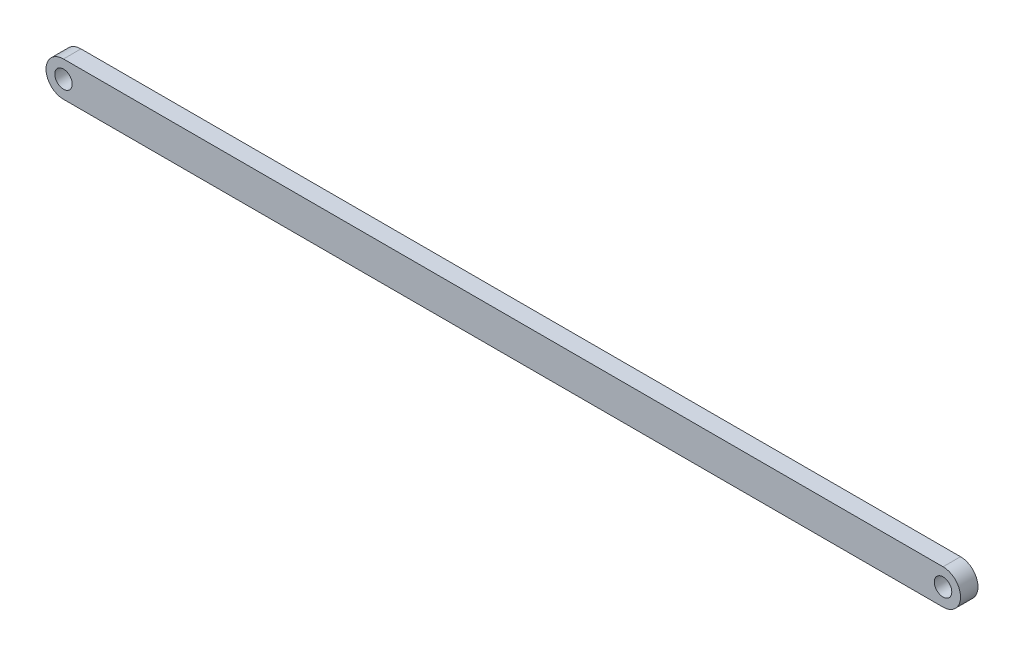
ISO-10303-21;
HEADER;
FILE_DESCRIPTION(('STEP AP214'),'2;1');
FILE_NAME('part.step','',(''),(''),'','','');
FILE_SCHEMA(('AUTOMOTIVE_DESIGN { 1 0 10303 214 1 1 1 1 }'));
ENDSEC;
DATA;
#1=APPLICATION_CONTEXT('core data for automotive mechanical design processes');
#2=APPLICATION_PROTOCOL_DEFINITION('international standard','automotive_design',2000,#1);
#3=PRODUCT_CONTEXT('',#1,'mechanical');
#4=PRODUCT('Part','Part','',(#3));
#5=PRODUCT_RELATED_PRODUCT_CATEGORY('part','',(#4));
#6=PRODUCT_DEFINITION_FORMATION('','',#4);
#7=PRODUCT_DEFINITION_CONTEXT('part definition',#1,'design');
#8=PRODUCT_DEFINITION('design','',#6,#7);
#9=PRODUCT_DEFINITION_SHAPE('','',#8);
#10=(LENGTH_UNIT() NAMED_UNIT(*) SI_UNIT(.MILLI.,.METRE.));
#11=(NAMED_UNIT(*) PLANE_ANGLE_UNIT() SI_UNIT($,.RADIAN.));
#12=(NAMED_UNIT(*) SI_UNIT($,.STERADIAN.) SOLID_ANGLE_UNIT());
#13=UNCERTAINTY_MEASURE_WITH_UNIT(LENGTH_MEASURE(1.E-05),#10,'distance_accuracy_value','');
#14=(GEOMETRIC_REPRESENTATION_CONTEXT(3) GLOBAL_UNCERTAINTY_ASSIGNED_CONTEXT((#13)) GLOBAL_UNIT_ASSIGNED_CONTEXT((#10,
#11,#12)) REPRESENTATION_CONTEXT('',''));
#15=CARTESIAN_POINT('',(0.,0.,0.));
#16=DIRECTION('',(0.,0.,1.));
#17=DIRECTION('',(1.,0.,0.));
#18=AXIS2_PLACEMENT_3D('',#15,#16,#17);
#19=CARTESIAN_POINT('',(125.84,0.,5.));
#20=DIRECTION('',(0.,0.,-1.));
#21=DIRECTION('',(-1.,0.,0.));
#22=AXIS2_PLACEMENT_3D('',#19,#20,#21);
#23=PLANE('',#22);
#24=CARTESIAN_POINT('',(125.84,0.,5.));
#25=DIRECTION('',(0.,0.,1.));
#26=DIRECTION('',(-1.,0.,0.));
#27=AXIS2_PLACEMENT_3D('',#24,#25,#26);
#28=CIRCLE('',#27,5.);
#29=CARTESIAN_POINT('',(125.84,-5.,5.));
#30=VERTEX_POINT('',#29);
#31=CARTESIAN_POINT('',(125.84,5.,5.));
#32=VERTEX_POINT('',#31);
#33=EDGE_CURVE('E96',#30,#32,#28,.T.);
#34=ORIENTED_EDGE('',*,*,#33,.T.);
#35=DIRECTION('',(-1.,0.,0.));
#36=VECTOR('',#35,1.);
#37=CARTESIAN_POINT('',(-125.84,5.,5.));
#38=LINE('',#37,#36);
#39=CARTESIAN_POINT('',(-125.84,5.,5.));
#40=VERTEX_POINT('',#39);
#41=EDGE_CURVE('E91',#32,#40,#38,.T.);
#42=ORIENTED_EDGE('',*,*,#41,.T.);
#43=CARTESIAN_POINT('',(-125.84,0.,5.));
#44=DIRECTION('',(0.,0.,1.));
#45=DIRECTION('',(1.,0.,0.));
#46=AXIS2_PLACEMENT_3D('',#43,#44,#45);
#47=CIRCLE('',#46,5.);
#48=CARTESIAN_POINT('',(-125.84,-5.,5.));
#49=VERTEX_POINT('',#48);
#50=EDGE_CURVE('E94',#40,#49,#47,.T.);
#51=ORIENTED_EDGE('',*,*,#50,.T.);
#52=DIRECTION('',(1.,0.,0.));
#53=VECTOR('',#52,1.);
#54=CARTESIAN_POINT('',(-125.84,-5.,5.));
#55=LINE('',#54,#53);
#56=EDGE_CURVE('E61',#49,#30,#55,.T.);
#57=ORIENTED_EDGE('',*,*,#56,.T.);
#58=EDGE_LOOP('',(#34,#42,#51,#57));
#59=FACE_BOUND('',#58,.T.);
#60=CARTESIAN_POINT('',(-125.84,0.,5.));
#61=DIRECTION('',(0.,0.,1.));
#62=DIRECTION('',(1.,0.,0.));
#63=AXIS2_PLACEMENT_3D('',#60,#61,#62);
#64=CIRCLE('',#63,2.5);
#65=CARTESIAN_POINT('',(-123.34,0.,5.));
#66=VERTEX_POINT('',#65);
#67=EDGE_CURVE('E116',#66,#66,#64,.T.);
#68=ORIENTED_EDGE('',*,*,#67,.F.);
#69=EDGE_LOOP('',(#68));
#70=FACE_BOUND('',#69,.T.);
#71=CARTESIAN_POINT('',(125.84,0.,5.));
#72=DIRECTION('',(0.,0.,1.));
#73=DIRECTION('',(1.,0.,0.));
#74=AXIS2_PLACEMENT_3D('',#71,#72,#73);
#75=CIRCLE('',#74,2.5);
#76=CARTESIAN_POINT('',(128.34,0.,5.));
#77=VERTEX_POINT('',#76);
#78=EDGE_CURVE('E138',#77,#77,#75,.T.);
#79=ORIENTED_EDGE('',*,*,#78,.F.);
#80=EDGE_LOOP('',(#79));
#81=FACE_BOUND('',#80,.T.);
#82=ADVANCED_FACE('F43',(#59,#70,#81),#23,.F.);
#83=CARTESIAN_POINT('',(125.84,0.,0.));
#84=DIRECTION('',(0.,0.,-1.));
#85=DIRECTION('',(-1.,0.,0.));
#86=AXIS2_PLACEMENT_3D('',#83,#84,#85);
#87=PLANE('',#86);
#88=CARTESIAN_POINT('',(-125.84,0.,0.));
#89=DIRECTION('',(0.,0.,1.));
#90=DIRECTION('',(1.,0.,0.));
#91=AXIS2_PLACEMENT_3D('',#88,#89,#90);
#92=CIRCLE('',#91,2.5);
#93=CARTESIAN_POINT('',(-123.34,0.,0.));
#94=VERTEX_POINT('',#93);
#95=EDGE_CURVE('E134',#94,#94,#92,.T.);
#96=ORIENTED_EDGE('',*,*,#95,.T.);
#97=EDGE_LOOP('',(#96));
#98=FACE_BOUND('',#97,.T.);
#99=CARTESIAN_POINT('',(125.84,0.,0.));
#100=DIRECTION('',(0.,0.,1.));
#101=DIRECTION('',(-1.,0.,0.));
#102=AXIS2_PLACEMENT_3D('',#99,#100,#101);
#103=CIRCLE('',#102,5.);
#104=CARTESIAN_POINT('',(125.84,-5.,0.));
#105=VERTEX_POINT('',#104);
#106=CARTESIAN_POINT('',(125.84,5.,0.));
#107=VERTEX_POINT('',#106);
#108=EDGE_CURVE('E112',#105,#107,#103,.T.);
#109=ORIENTED_EDGE('',*,*,#108,.F.);
#110=DIRECTION('',(1.,0.,0.));
#111=VECTOR('',#110,1.);
#112=CARTESIAN_POINT('',(-125.84,-5.,0.));
#113=LINE('',#112,#111);
#114=CARTESIAN_POINT('',(-125.84,-5.,0.));
#115=VERTEX_POINT('',#114);
#116=EDGE_CURVE('E84',#115,#105,#113,.T.);
#117=ORIENTED_EDGE('',*,*,#116,.F.);
#118=CARTESIAN_POINT('',(-125.84,0.,0.));
#119=DIRECTION('',(0.,0.,1.));
#120=DIRECTION('',(1.,0.,0.));
#121=AXIS2_PLACEMENT_3D('',#118,#119,#120);
#122=CIRCLE('',#121,5.);
#123=CARTESIAN_POINT('',(-125.84,5.,0.));
#124=VERTEX_POINT('',#123);
#125=EDGE_CURVE('E78',#124,#115,#122,.T.);
#126=ORIENTED_EDGE('',*,*,#125,.F.);
#127=DIRECTION('',(-1.,0.,0.));
#128=VECTOR('',#127,1.);
#129=CARTESIAN_POINT('',(-125.84,5.,0.));
#130=LINE('',#129,#128);
#131=EDGE_CURVE('E101',#107,#124,#130,.T.);
#132=ORIENTED_EDGE('',*,*,#131,.F.);
#133=EDGE_LOOP('',(#109,#117,#126,#132));
#134=FACE_BOUND('',#133,.T.);
#135=CARTESIAN_POINT('',(125.84,0.,0.));
#136=DIRECTION('',(0.,0.,1.));
#137=DIRECTION('',(1.,0.,0.));
#138=AXIS2_PLACEMENT_3D('',#135,#136,#137);
#139=CIRCLE('',#138,2.5);
#140=CARTESIAN_POINT('',(128.34,0.,0.));
#141=VERTEX_POINT('',#140);
#142=EDGE_CURVE('E142',#141,#141,#139,.T.);
#143=ORIENTED_EDGE('',*,*,#142,.T.);
#144=EDGE_LOOP('',(#143));
#145=FACE_BOUND('',#144,.T.);
#146=ADVANCED_FACE('F129',(#98,#134,#145),#87,.T.);
#147=CARTESIAN_POINT('',(125.84,0.,5.));
#148=DIRECTION('',(0.,0.,-1.));
#149=DIRECTION('',(-1.,0.,0.));
#150=AXIS2_PLACEMENT_3D('',#147,#148,#149);
#151=CYLINDRICAL_SURFACE('',#150,5.);
#152=ORIENTED_EDGE('',*,*,#108,.T.);
#153=DIRECTION('',(0.,0.,-1.));
#154=VECTOR('',#153,1.);
#155=CARTESIAN_POINT('',(125.84,5.,5.));
#156=LINE('',#155,#154);
#157=EDGE_CURVE('E11',#32,#107,#156,.T.);
#158=ORIENTED_EDGE('',*,*,#157,.F.);
#159=ORIENTED_EDGE('',*,*,#33,.F.);
#160=DIRECTION('',(0.,0.,-1.));
#161=VECTOR('',#160,1.);
#162=CARTESIAN_POINT('',(125.84,-5.,5.));
#163=LINE('',#162,#161);
#164=EDGE_CURVE('E108',#30,#105,#163,.T.);
#165=ORIENTED_EDGE('',*,*,#164,.T.);
#166=EDGE_LOOP('',(#152,#158,#159,#165));
#167=FACE_BOUND('',#166,.T.);
#168=ADVANCED_FACE('F45',(#167),#151,.T.);
#169=CARTESIAN_POINT('',(-125.84,5.,5.));
#170=DIRECTION('',(0.,-1.,0.));
#171=DIRECTION('',(0.,0.,-1.));
#172=AXIS2_PLACEMENT_3D('',#169,#170,#171);
#173=PLANE('',#172);
#174=ORIENTED_EDGE('',*,*,#131,.T.);
#175=DIRECTION('',(0.,0.,-1.));
#176=VECTOR('',#175,1.);
#177=CARTESIAN_POINT('',(-125.84,5.,5.));
#178=LINE('',#177,#176);
#179=EDGE_CURVE('E53',#40,#124,#178,.T.);
#180=ORIENTED_EDGE('',*,*,#179,.F.);
#181=ORIENTED_EDGE('',*,*,#41,.F.);
#182=ORIENTED_EDGE('',*,*,#157,.T.);
#183=EDGE_LOOP('',(#174,#180,#181,#182));
#184=FACE_BOUND('',#183,.T.);
#185=ADVANCED_FACE('F100',(#184),#173,.F.);
#186=CARTESIAN_POINT('',(-125.84,0.,5.));
#187=DIRECTION('',(0.,0.,-1.));
#188=DIRECTION('',(-1.,0.,0.));
#189=AXIS2_PLACEMENT_3D('',#186,#187,#188);
#190=CYLINDRICAL_SURFACE('',#189,5.);
#191=ORIENTED_EDGE('',*,*,#125,.T.);
#192=DIRECTION('',(0.,0.,-1.));
#193=VECTOR('',#192,1.);
#194=CARTESIAN_POINT('',(-125.84,-5.,5.));
#195=LINE('',#194,#193);
#196=EDGE_CURVE('E103',#49,#115,#195,.T.);
#197=ORIENTED_EDGE('',*,*,#196,.F.);
#198=ORIENTED_EDGE('',*,*,#50,.F.);
#199=ORIENTED_EDGE('',*,*,#179,.T.);
#200=EDGE_LOOP('',(#191,#197,#198,#199));
#201=FACE_BOUND('',#200,.T.);
#202=ADVANCED_FACE('F104',(#201),#190,.T.);
#203=CARTESIAN_POINT('',(-125.84,-5.,5.));
#204=DIRECTION('',(0.,1.,0.));
#205=DIRECTION('',(0.,0.,1.));
#206=AXIS2_PLACEMENT_3D('',#203,#204,#205);
#207=PLANE('',#206);
#208=ORIENTED_EDGE('',*,*,#116,.T.);
#209=ORIENTED_EDGE('',*,*,#164,.F.);
#210=ORIENTED_EDGE('',*,*,#56,.F.);
#211=ORIENTED_EDGE('',*,*,#196,.T.);
#212=EDGE_LOOP('',(#208,#209,#210,#211));
#213=FACE_BOUND('',#212,.T.);
#214=ADVANCED_FACE('F126',(#213),#207,.F.);
#215=CARTESIAN_POINT('',(-125.84,0.,5.));
#216=DIRECTION('',(0.,0.,-1.));
#217=DIRECTION('',(-1.,0.,0.));
#218=AXIS2_PLACEMENT_3D('',#215,#216,#217);
#219=CYLINDRICAL_SURFACE('',#218,2.5);
#220=ORIENTED_EDGE('',*,*,#67,.T.);
#221=EDGE_LOOP('',(#220));
#222=FACE_BOUND('',#221,.T.);
#223=ORIENTED_EDGE('',*,*,#95,.F.);
#224=EDGE_LOOP('',(#223));
#225=FACE_BOUND('',#224,.T.);
#226=ADVANCED_FACE('F161',(#222,#225),#219,.F.);
#227=CARTESIAN_POINT('',(125.84,0.,5.));
#228=DIRECTION('',(0.,0.,-1.));
#229=DIRECTION('',(-1.,0.,0.));
#230=AXIS2_PLACEMENT_3D('',#227,#228,#229);
#231=CYLINDRICAL_SURFACE('',#230,2.5);
#232=ORIENTED_EDGE('',*,*,#78,.T.);
#233=EDGE_LOOP('',(#232));
#234=FACE_BOUND('',#233,.T.);
#235=ORIENTED_EDGE('',*,*,#142,.F.);
#236=EDGE_LOOP('',(#235));
#237=FACE_BOUND('',#236,.T.);
#238=ADVANCED_FACE('F150',(#234,#237),#231,.F.);
#239=CLOSED_SHELL('',(#82,#146,#168,#185,#202,#214,#226,#238));
#240=MANIFOLD_SOLID_BREP('B2',#239);
#241=ADVANCED_BREP_SHAPE_REPRESENTATION('',(#18,#240),#14);
#242=SHAPE_DEFINITION_REPRESENTATION(#9,#241);
ENDSEC;
END-ISO-10303-21;
